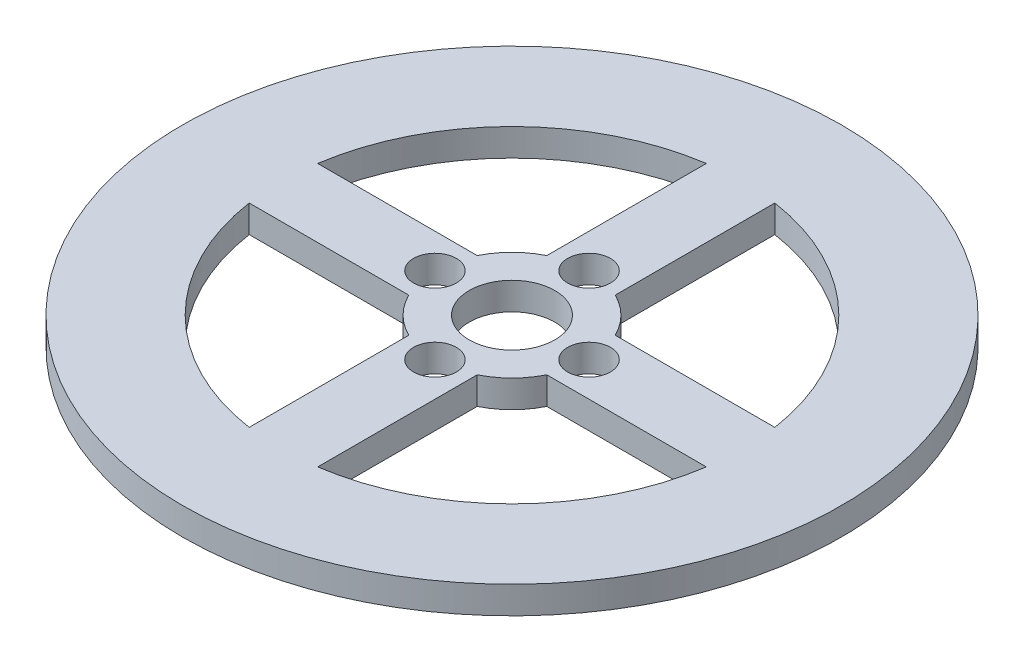
ISO-10303-21;
HEADER;
FILE_DESCRIPTION(('STEP AP214'),'2;1');
FILE_NAME('part.step','',(''),(''),'','','');
FILE_SCHEMA(('AUTOMOTIVE_DESIGN { 1 0 10303 214 1 1 1 1 }'));
ENDSEC;
DATA;
#1=APPLICATION_CONTEXT('core data for automotive mechanical design processes');
#2=APPLICATION_PROTOCOL_DEFINITION('international standard','automotive_design',2000,#1);
#3=PRODUCT_CONTEXT('',#1,'mechanical');
#4=PRODUCT('Part','Part','',(#3));
#5=PRODUCT_RELATED_PRODUCT_CATEGORY('part','',(#4));
#6=PRODUCT_DEFINITION_FORMATION('','',#4);
#7=PRODUCT_DEFINITION_CONTEXT('part definition',#1,'design');
#8=PRODUCT_DEFINITION('design','',#6,#7);
#9=PRODUCT_DEFINITION_SHAPE('','',#8);
#10=(LENGTH_UNIT() NAMED_UNIT(*) SI_UNIT(.MILLI.,.METRE.));
#11=(NAMED_UNIT(*) PLANE_ANGLE_UNIT() SI_UNIT($,.RADIAN.));
#12=(NAMED_UNIT(*) SI_UNIT($,.STERADIAN.) SOLID_ANGLE_UNIT());
#13=UNCERTAINTY_MEASURE_WITH_UNIT(LENGTH_MEASURE(1.E-05),#10,'distance_accuracy_value','');
#14=(GEOMETRIC_REPRESENTATION_CONTEXT(3) GLOBAL_UNCERTAINTY_ASSIGNED_CONTEXT((#13)) GLOBAL_UNIT_ASSIGNED_CONTEXT((#10,
#11,#12)) REPRESENTATION_CONTEXT('',''));
#15=CARTESIAN_POINT('',(0.,0.,0.));
#16=DIRECTION('',(0.,0.,1.));
#17=DIRECTION('',(1.,0.,0.));
#18=AXIS2_PLACEMENT_3D('',#15,#16,#17);
#19=CARTESIAN_POINT('',(0.,1.6,0.));
#20=DIRECTION('',(0.,1.,0.));
#21=DIRECTION('',(0.,0.,1.));
#22=AXIS2_PLACEMENT_3D('',#19,#20,#21);
#23=PLANE('',#22);
#24=CARTESIAN_POINT('',(0.,1.6,-4.5));
#25=DIRECTION('',(0.,1.,0.));
#26=DIRECTION('',(0.,0.,1.));
#27=AXIS2_PLACEMENT_3D('',#24,#25,#26);
#28=CIRCLE('',#27,1.25);
#29=CARTESIAN_POINT('',(0.,1.6,-3.25));
#30=VERTEX_POINT('',#29);
#31=EDGE_CURVE('E291',#30,#30,#28,.T.);
#32=ORIENTED_EDGE('',*,*,#31,.F.);
#33=EDGE_LOOP('',(#32));
#34=FACE_BOUND('',#33,.T.);
#35=CARTESIAN_POINT('',(2.54142111694787E-13,1.6,4.5));
#36=DIRECTION('',(0.,1.,0.));
#37=DIRECTION('',(0.,0.,1.));
#38=AXIS2_PLACEMENT_3D('',#35,#36,#37);
#39=CIRCLE('',#38,1.25000000000027);
#40=CARTESIAN_POINT('',(2.54142111694787E-13,1.6,5.75000000000027));
#41=VERTEX_POINT('',#40);
#42=EDGE_CURVE('E302',#41,#41,#39,.T.);
#43=ORIENTED_EDGE('',*,*,#42,.F.);
#44=EDGE_LOOP('',(#43));
#45=FACE_BOUND('',#44,.T.);
#46=CARTESIAN_POINT('',(4.50000000000013,1.6,-1.27071055847394E-13));
#47=DIRECTION('',(0.,1.,0.));
#48=DIRECTION('',(0.,0.,1.));
#49=AXIS2_PLACEMENT_3D('',#46,#47,#48);
#50=CIRCLE('',#49,1.2500000000001);
#51=CARTESIAN_POINT('',(4.50000000000013,1.6,1.24999999999997));
#52=VERTEX_POINT('',#51);
#53=EDGE_CURVE('E295',#52,#52,#50,.T.);
#54=ORIENTED_EDGE('',*,*,#53,.F.);
#55=EDGE_LOOP('',(#54));
#56=FACE_BOUND('',#55,.T.);
#57=CARTESIAN_POINT('',(0.,1.6,0.));
#58=DIRECTION('',(0.,1.,0.));
#59=DIRECTION('',(0.,0.,1.));
#60=AXIS2_PLACEMENT_3D('',#57,#58,#59);
#61=CIRCLE('',#60,2.5);
#62=CARTESIAN_POINT('',(0.,1.6,2.5));
#63=VERTEX_POINT('',#62);
#64=EDGE_CURVE('E312',#63,#63,#61,.T.);
#65=ORIENTED_EDGE('',*,*,#64,.F.);
#66=EDGE_LOOP('',(#65));
#67=FACE_BOUND('',#66,.T.);
#68=CARTESIAN_POINT('',(-4.49999999999987,1.6,1.2762214690701E-13));
#69=DIRECTION('',(0.,1.,0.));
#70=DIRECTION('',(0.,0.,1.));
#71=AXIS2_PLACEMENT_3D('',#68,#69,#70);
#72=CIRCLE('',#71,1.2500000000002);
#73=CARTESIAN_POINT('',(-4.49999999999987,1.6,1.25000000000033));
#74=VERTEX_POINT('',#73);
#75=EDGE_CURVE('E294',#74,#74,#72,.T.);
#76=ORIENTED_EDGE('',*,*,#75,.F.);
#77=EDGE_LOOP('',(#76));
#78=FACE_BOUND('',#77,.T.);
#79=CARTESIAN_POINT('',(0.,1.6,0.));
#80=DIRECTION('',(0.,1.,0.));
#81=DIRECTION('',(0.,0.,1.));
#82=AXIS2_PLACEMENT_3D('',#79,#80,#81);
#83=CIRCLE('',#82,19.25);
#84=CARTESIAN_POINT('',(0.,1.6,19.25));
#85=VERTEX_POINT('',#84);
#86=EDGE_CURVE('E12',#85,#85,#83,.T.);
#87=ORIENTED_EDGE('',*,*,#86,.T.);
#88=EDGE_LOOP('',(#87));
#89=FACE_BOUND('',#88,.T.);
#90=DIRECTION('',(0.,0.,1.));
#91=VECTOR('',#90,1.);
#92=CARTESIAN_POINT('',(-2.,1.6,0.));
#93=LINE('',#92,#91);
#94=CARTESIAN_POINT('',(-2.,1.6,-13.3510299228187));
#95=VERTEX_POINT('',#94);
#96=CARTESIAN_POINT('',(-2.,1.6,-4.03112887414927));
#97=VERTEX_POINT('',#96);
#98=EDGE_CURVE('E270',#95,#97,#93,.T.);
#99=ORIENTED_EDGE('',*,*,#98,.T.);
#100=CARTESIAN_POINT('',(0.,1.6,0.));
#101=DIRECTION('',(0.,1.,0.));
#102=DIRECTION('',(0.,0.,1.));
#103=AXIS2_PLACEMENT_3D('',#100,#101,#102);
#104=CIRCLE('',#103,4.5);
#105=CARTESIAN_POINT('',(-4.03112887414927,1.6,-2.));
#106=VERTEX_POINT('',#105);
#107=EDGE_CURVE('E198',#97,#106,#104,.T.);
#108=ORIENTED_EDGE('',*,*,#107,.T.);
#109=DIRECTION('',(-1.,0.,0.));
#110=VECTOR('',#109,1.);
#111=CARTESIAN_POINT('',(0.,1.6,-2.));
#112=LINE('',#111,#110);
#113=CARTESIAN_POINT('',(-13.3510299228187,1.6,-2.));
#114=VERTEX_POINT('',#113);
#115=EDGE_CURVE('E260',#106,#114,#112,.T.);
#116=ORIENTED_EDGE('',*,*,#115,.T.);
#117=CARTESIAN_POINT('',(0.,1.6,0.));
#118=DIRECTION('',(0.,1.,0.));
#119=DIRECTION('',(0.,0.,1.));
#120=AXIS2_PLACEMENT_3D('',#117,#118,#119);
#121=CIRCLE('',#120,13.5);
#122=EDGE_CURVE('E273',#95,#114,#121,.T.);
#123=ORIENTED_EDGE('',*,*,#122,.F.);
#124=EDGE_LOOP('',(#99,#108,#116,#123));
#125=FACE_BOUND('',#124,.T.);
#126=DIRECTION('',(1.,0.,0.));
#127=VECTOR('',#126,1.);
#128=CARTESIAN_POINT('',(0.,1.6,-2.));
#129=LINE('',#128,#127);
#130=CARTESIAN_POINT('',(4.03112887414927,1.6,-2.));
#131=VERTEX_POINT('',#130);
#132=CARTESIAN_POINT('',(13.3510299228187,1.6,-2.));
#133=VERTEX_POINT('',#132);
#134=EDGE_CURVE('E191',#131,#133,#129,.T.);
#135=ORIENTED_EDGE('',*,*,#134,.F.);
#136=CARTESIAN_POINT('',(0.,1.6,0.));
#137=DIRECTION('',(0.,1.,0.));
#138=DIRECTION('',(0.,0.,1.));
#139=AXIS2_PLACEMENT_3D('',#136,#137,#138);
#140=CIRCLE('',#139,4.5);
#141=CARTESIAN_POINT('',(2.,1.6,-4.03112887414927));
#142=VERTEX_POINT('',#141);
#143=EDGE_CURVE('E163',#131,#142,#140,.T.);
#144=ORIENTED_EDGE('',*,*,#143,.T.);
#145=DIRECTION('',(0.,0.,1.));
#146=VECTOR('',#145,1.);
#147=CARTESIAN_POINT('',(2.,1.6,0.));
#148=LINE('',#147,#146);
#149=CARTESIAN_POINT('',(2.,1.6,-13.3510299228187));
#150=VERTEX_POINT('',#149);
#151=EDGE_CURVE('E182',#150,#142,#148,.T.);
#152=ORIENTED_EDGE('',*,*,#151,.F.);
#153=CARTESIAN_POINT('',(0.,1.6,0.));
#154=DIRECTION('',(0.,1.,0.));
#155=DIRECTION('',(0.,0.,1.));
#156=AXIS2_PLACEMENT_3D('',#153,#154,#155);
#157=CIRCLE('',#156,13.5);
#158=EDGE_CURVE('E185',#133,#150,#157,.T.);
#159=ORIENTED_EDGE('',*,*,#158,.F.);
#160=EDGE_LOOP('',(#135,#144,#152,#159));
#161=FACE_BOUND('',#160,.T.);
#162=DIRECTION('',(0.,0.,-1.));
#163=VECTOR('',#162,1.);
#164=CARTESIAN_POINT('',(2.,1.6,0.));
#165=LINE('',#164,#163);
#166=CARTESIAN_POINT('',(2.,1.6,13.3510299228187));
#167=VERTEX_POINT('',#166);
#168=CARTESIAN_POINT('',(2.,1.6,4.03112887414927));
#169=VERTEX_POINT('',#168);
#170=EDGE_CURVE('E214',#167,#169,#165,.T.);
#171=ORIENTED_EDGE('',*,*,#170,.T.);
#172=CARTESIAN_POINT('',(0.,1.6,0.));
#173=DIRECTION('',(0.,1.,0.));
#174=DIRECTION('',(0.,0.,1.));
#175=AXIS2_PLACEMENT_3D('',#172,#173,#174);
#176=CIRCLE('',#175,4.5);
#177=CARTESIAN_POINT('',(4.03112887414927,1.6,2.));
#178=VERTEX_POINT('',#177);
#179=EDGE_CURVE('E65',#169,#178,#176,.T.);
#180=ORIENTED_EDGE('',*,*,#179,.T.);
#181=DIRECTION('',(1.,0.,0.));
#182=VECTOR('',#181,1.);
#183=CARTESIAN_POINT('',(0.,1.6,2.));
#184=LINE('',#183,#182);
#185=CARTESIAN_POINT('',(13.3510299228187,1.6,2.));
#186=VERTEX_POINT('',#185);
#187=EDGE_CURVE('E205',#178,#186,#184,.T.);
#188=ORIENTED_EDGE('',*,*,#187,.T.);
#189=CARTESIAN_POINT('',(0.,1.6,0.));
#190=DIRECTION('',(0.,1.,0.));
#191=DIRECTION('',(0.,0.,1.));
#192=AXIS2_PLACEMENT_3D('',#189,#190,#191);
#193=CIRCLE('',#192,13.5);
#194=EDGE_CURVE('E218',#167,#186,#193,.T.);
#195=ORIENTED_EDGE('',*,*,#194,.F.);
#196=EDGE_LOOP('',(#171,#180,#188,#195));
#197=FACE_BOUND('',#196,.T.);
#198=DIRECTION('',(-1.,0.,0.));
#199=VECTOR('',#198,1.);
#200=CARTESIAN_POINT('',(0.,1.6,2.));
#201=LINE('',#200,#199);
#202=CARTESIAN_POINT('',(-4.03112887414927,1.6,2.));
#203=VERTEX_POINT('',#202);
#204=CARTESIAN_POINT('',(-13.3510299228187,1.6,2.));
#205=VERTEX_POINT('',#204);
#206=EDGE_CURVE('E243',#203,#205,#201,.T.);
#207=ORIENTED_EDGE('',*,*,#206,.F.);
#208=CARTESIAN_POINT('',(0.,1.6,0.));
#209=DIRECTION('',(0.,1.,0.));
#210=DIRECTION('',(0.,0.,1.));
#211=AXIS2_PLACEMENT_3D('',#208,#209,#210);
#212=CIRCLE('',#211,4.5);
#213=CARTESIAN_POINT('',(-2.,1.6,4.03112887414927));
#214=VERTEX_POINT('',#213);
#215=EDGE_CURVE('E57',#203,#214,#212,.T.);
#216=ORIENTED_EDGE('',*,*,#215,.T.);
#217=DIRECTION('',(0.,0.,-1.));
#218=VECTOR('',#217,1.);
#219=CARTESIAN_POINT('',(-2.,1.6,0.));
#220=LINE('',#219,#218);
#221=CARTESIAN_POINT('',(-2.,1.6,13.3510299228187));
#222=VERTEX_POINT('',#221);
#223=EDGE_CURVE('E232',#222,#214,#220,.T.);
#224=ORIENTED_EDGE('',*,*,#223,.F.);
#225=CARTESIAN_POINT('',(0.,1.6,0.));
#226=DIRECTION('',(0.,1.,0.));
#227=DIRECTION('',(0.,0.,1.));
#228=AXIS2_PLACEMENT_3D('',#225,#226,#227);
#229=CIRCLE('',#228,13.5);
#230=EDGE_CURVE('E246',#205,#222,#229,.T.);
#231=ORIENTED_EDGE('',*,*,#230,.F.);
#232=EDGE_LOOP('',(#207,#216,#224,#231));
#233=FACE_BOUND('',#232,.T.);
#234=ADVANCED_FACE('F42',(#34,#45,#56,#67,#78,#89,#125,#161,#197,#233),#23,.T.);
#235=CARTESIAN_POINT('',(0.,0.,0.));
#236=DIRECTION('',(0.,1.,0.));
#237=DIRECTION('',(0.,0.,1.));
#238=AXIS2_PLACEMENT_3D('',#235,#236,#237);
#239=PLANE('',#238);
#240=CARTESIAN_POINT('',(0.,0.,0.));
#241=DIRECTION('',(0.,1.,0.));
#242=DIRECTION('',(0.,0.,1.));
#243=AXIS2_PLACEMENT_3D('',#240,#241,#242);
#244=CIRCLE('',#243,4.5);
#245=CARTESIAN_POINT('',(2.,0.,4.03112887414927));
#246=VERTEX_POINT('',#245);
#247=CARTESIAN_POINT('',(4.03112887414927,0.,2.));
#248=VERTEX_POINT('',#247);
#249=EDGE_CURVE('E202',#246,#248,#244,.T.);
#250=ORIENTED_EDGE('',*,*,#249,.F.);
#251=DIRECTION('',(0.,0.,-1.));
#252=VECTOR('',#251,1.);
#253=CARTESIAN_POINT('',(2.,0.,0.));
#254=LINE('',#253,#252);
#255=CARTESIAN_POINT('',(2.,0.,13.3510299228187));
#256=VERTEX_POINT('',#255);
#257=EDGE_CURVE('E204',#256,#246,#254,.T.);
#258=ORIENTED_EDGE('',*,*,#257,.F.);
#259=CARTESIAN_POINT('',(0.,0.,0.));
#260=DIRECTION('',(0.,1.,0.));
#261=DIRECTION('',(0.,0.,1.));
#262=AXIS2_PLACEMENT_3D('',#259,#260,#261);
#263=CIRCLE('',#262,13.5);
#264=CARTESIAN_POINT('',(13.3510299228187,0.,2.));
#265=VERTEX_POINT('',#264);
#266=EDGE_CURVE('E207',#256,#265,#263,.T.);
#267=ORIENTED_EDGE('',*,*,#266,.T.);
#268=DIRECTION('',(1.,0.,0.));
#269=VECTOR('',#268,1.);
#270=CARTESIAN_POINT('',(0.,0.,2.));
#271=LINE('',#270,#269);
#272=EDGE_CURVE('E210',#248,#265,#271,.T.);
#273=ORIENTED_EDGE('',*,*,#272,.F.);
#274=EDGE_LOOP('',(#250,#258,#267,#273));
#275=FACE_BOUND('',#274,.T.);
#276=CARTESIAN_POINT('',(0.,0.,0.));
#277=DIRECTION('',(0.,1.,0.));
#278=DIRECTION('',(0.,0.,1.));
#279=AXIS2_PLACEMENT_3D('',#276,#277,#278);
#280=CIRCLE('',#279,4.5);
#281=CARTESIAN_POINT('',(-2.,0.,-4.03112887414927));
#282=VERTEX_POINT('',#281);
#283=CARTESIAN_POINT('',(-4.03112887414927,0.,-2.));
#284=VERTEX_POINT('',#283);
#285=EDGE_CURVE('E257',#282,#284,#280,.T.);
#286=ORIENTED_EDGE('',*,*,#285,.F.);
#287=DIRECTION('',(0.,0.,1.));
#288=VECTOR('',#287,1.);
#289=CARTESIAN_POINT('',(-2.,0.,0.));
#290=LINE('',#289,#288);
#291=CARTESIAN_POINT('',(-2.,0.,-13.3510299228187));
#292=VERTEX_POINT('',#291);
#293=EDGE_CURVE('E259',#292,#282,#290,.T.);
#294=ORIENTED_EDGE('',*,*,#293,.F.);
#295=CARTESIAN_POINT('',(0.,0.,0.));
#296=DIRECTION('',(0.,1.,0.));
#297=DIRECTION('',(0.,0.,1.));
#298=AXIS2_PLACEMENT_3D('',#295,#296,#297);
#299=CIRCLE('',#298,13.5);
#300=CARTESIAN_POINT('',(-13.3510299228187,0.,-2.));
#301=VERTEX_POINT('',#300);
#302=EDGE_CURVE('E262',#292,#301,#299,.T.);
#303=ORIENTED_EDGE('',*,*,#302,.T.);
#304=DIRECTION('',(-1.,0.,0.));
#305=VECTOR('',#304,1.);
#306=CARTESIAN_POINT('',(0.,0.,-2.));
#307=LINE('',#306,#305);
#308=EDGE_CURVE('E265',#284,#301,#307,.T.);
#309=ORIENTED_EDGE('',*,*,#308,.F.);
#310=EDGE_LOOP('',(#286,#294,#303,#309));
#311=FACE_BOUND('',#310,.T.);
#312=CARTESIAN_POINT('',(0.,0.,-4.5));
#313=DIRECTION('',(0.,1.,0.));
#314=DIRECTION('',(0.,0.,1.));
#315=AXIS2_PLACEMENT_3D('',#312,#313,#314);
#316=CIRCLE('',#315,1.25);
#317=CARTESIAN_POINT('',(0.,0.,-3.25));
#318=VERTEX_POINT('',#317);
#319=EDGE_CURVE('E288',#318,#318,#316,.T.);
#320=ORIENTED_EDGE('',*,*,#319,.T.);
#321=EDGE_LOOP('',(#320));
#322=FACE_BOUND('',#321,.T.);
#323=CARTESIAN_POINT('',(2.54142111694787E-13,0.,4.5));
#324=DIRECTION('',(0.,1.,0.));
#325=DIRECTION('',(0.,0.,1.));
#326=AXIS2_PLACEMENT_3D('',#323,#324,#325);
#327=CIRCLE('',#326,1.25000000000027);
#328=CARTESIAN_POINT('',(2.54142111694787E-13,0.,5.75000000000027));
#329=VERTEX_POINT('',#328);
#330=EDGE_CURVE('E281',#329,#329,#327,.T.);
#331=ORIENTED_EDGE('',*,*,#330,.T.);
#332=EDGE_LOOP('',(#331));
#333=FACE_BOUND('',#332,.T.);
#334=CARTESIAN_POINT('',(4.50000000000013,0.,-1.27071055847394E-13));
#335=DIRECTION('',(0.,1.,0.));
#336=DIRECTION('',(0.,0.,1.));
#337=AXIS2_PLACEMENT_3D('',#334,#335,#336);
#338=CIRCLE('',#337,1.2500000000001);
#339=CARTESIAN_POINT('',(4.50000000000013,0.,1.24999999999997));
#340=VERTEX_POINT('',#339);
#341=EDGE_CURVE('E299',#340,#340,#338,.T.);
#342=ORIENTED_EDGE('',*,*,#341,.T.);
#343=EDGE_LOOP('',(#342));
#344=FACE_BOUND('',#343,.T.);
#345=CARTESIAN_POINT('',(0.,0.,0.));
#346=DIRECTION('',(0.,1.,0.));
#347=DIRECTION('',(0.,0.,1.));
#348=AXIS2_PLACEMENT_3D('',#345,#346,#347);
#349=CIRCLE('',#348,2.5);
#350=CARTESIAN_POINT('',(0.,0.,2.5));
#351=VERTEX_POINT('',#350);
#352=EDGE_CURVE('E298',#351,#351,#349,.T.);
#353=ORIENTED_EDGE('',*,*,#352,.T.);
#354=EDGE_LOOP('',(#353));
#355=FACE_BOUND('',#354,.T.);
#356=CARTESIAN_POINT('',(-4.49999999999987,0.,1.2762214690701E-13));
#357=DIRECTION('',(0.,1.,0.));
#358=DIRECTION('',(0.,0.,1.));
#359=AXIS2_PLACEMENT_3D('',#356,#357,#358);
#360=CIRCLE('',#359,1.2500000000002);
#361=CARTESIAN_POINT('',(-4.49999999999987,0.,1.25000000000033));
#362=VERTEX_POINT('',#361);
#363=EDGE_CURVE('E309',#362,#362,#360,.T.);
#364=ORIENTED_EDGE('',*,*,#363,.T.);
#365=EDGE_LOOP('',(#364));
#366=FACE_BOUND('',#365,.T.);
#367=CARTESIAN_POINT('',(0.,0.,0.));
#368=DIRECTION('',(0.,1.,0.));
#369=DIRECTION('',(0.,0.,1.));
#370=AXIS2_PLACEMENT_3D('',#367,#368,#369);
#371=CIRCLE('',#370,19.25);
#372=CARTESIAN_POINT('',(0.,0.,19.25));
#373=VERTEX_POINT('',#372);
#374=EDGE_CURVE('E46',#373,#373,#371,.T.);
#375=ORIENTED_EDGE('',*,*,#374,.F.);
#376=EDGE_LOOP('',(#375));
#377=FACE_BOUND('',#376,.T.);
#378=CARTESIAN_POINT('',(0.,0.,0.));
#379=DIRECTION('',(0.,1.,0.));
#380=DIRECTION('',(0.,0.,1.));
#381=AXIS2_PLACEMENT_3D('',#378,#379,#380);
#382=CIRCLE('',#381,4.5);
#383=CARTESIAN_POINT('',(4.03112887414927,0.,-2.));
#384=VERTEX_POINT('',#383);
#385=CARTESIAN_POINT('',(2.,0.,-4.03112887414927));
#386=VERTEX_POINT('',#385);
#387=EDGE_CURVE('E160',#384,#386,#382,.T.);
#388=ORIENTED_EDGE('',*,*,#387,.F.);
#389=DIRECTION('',(1.,0.,0.));
#390=VECTOR('',#389,1.);
#391=CARTESIAN_POINT('',(0.,0.,-2.));
#392=LINE('',#391,#390);
#393=CARTESIAN_POINT('',(13.3510299228187,0.,-2.));
#394=VERTEX_POINT('',#393);
#395=EDGE_CURVE('E172',#384,#394,#392,.T.);
#396=ORIENTED_EDGE('',*,*,#395,.T.);
#397=CARTESIAN_POINT('',(0.,0.,0.));
#398=DIRECTION('',(0.,1.,0.));
#399=DIRECTION('',(0.,0.,1.));
#400=AXIS2_PLACEMENT_3D('',#397,#398,#399);
#401=CIRCLE('',#400,13.5);
#402=CARTESIAN_POINT('',(2.,0.,-13.3510299228187));
#403=VERTEX_POINT('',#402);
#404=EDGE_CURVE('E176',#394,#403,#401,.T.);
#405=ORIENTED_EDGE('',*,*,#404,.T.);
#406=DIRECTION('',(0.,0.,1.));
#407=VECTOR('',#406,1.);
#408=CARTESIAN_POINT('',(2.,0.,0.));
#409=LINE('',#408,#407);
#410=EDGE_CURVE('E168',#403,#386,#409,.T.);
#411=ORIENTED_EDGE('',*,*,#410,.T.);
#412=EDGE_LOOP('',(#388,#396,#405,#411));
#413=FACE_BOUND('',#412,.T.);
#414=CARTESIAN_POINT('',(0.,0.,0.));
#415=DIRECTION('',(0.,1.,0.));
#416=DIRECTION('',(0.,0.,1.));
#417=AXIS2_PLACEMENT_3D('',#414,#415,#416);
#418=CIRCLE('',#417,4.5);
#419=CARTESIAN_POINT('',(-4.03112887414927,0.,2.));
#420=VERTEX_POINT('',#419);
#421=CARTESIAN_POINT('',(-2.,0.,4.03112887414927));
#422=VERTEX_POINT('',#421);
#423=EDGE_CURVE('E229',#420,#422,#418,.T.);
#424=ORIENTED_EDGE('',*,*,#423,.F.);
#425=DIRECTION('',(-1.,0.,0.));
#426=VECTOR('',#425,1.);
#427=CARTESIAN_POINT('',(0.,0.,2.));
#428=LINE('',#427,#426);
#429=CARTESIAN_POINT('',(-13.3510299228187,0.,2.));
#430=VERTEX_POINT('',#429);
#431=EDGE_CURVE('E231',#420,#430,#428,.T.);
#432=ORIENTED_EDGE('',*,*,#431,.T.);
#433=CARTESIAN_POINT('',(0.,0.,0.));
#434=DIRECTION('',(0.,1.,0.));
#435=DIRECTION('',(0.,0.,1.));
#436=AXIS2_PLACEMENT_3D('',#433,#434,#435);
#437=CIRCLE('',#436,13.5);
#438=CARTESIAN_POINT('',(-2.,0.,13.3510299228187));
#439=VERTEX_POINT('',#438);
#440=EDGE_CURVE('E235',#430,#439,#437,.T.);
#441=ORIENTED_EDGE('',*,*,#440,.T.);
#442=DIRECTION('',(0.,0.,-1.));
#443=VECTOR('',#442,1.);
#444=CARTESIAN_POINT('',(-2.,0.,0.));
#445=LINE('',#444,#443);
#446=EDGE_CURVE('E238',#439,#422,#445,.T.);
#447=ORIENTED_EDGE('',*,*,#446,.T.);
#448=EDGE_LOOP('',(#424,#432,#441,#447));
#449=FACE_BOUND('',#448,.T.);
#450=ADVANCED_FACE('F179',(#275,#311,#322,#333,#344,#355,#366,#377,#413,#449),#239,.F.);
#451=CARTESIAN_POINT('',(0.,1.6,0.));
#452=DIRECTION('',(0.,-1.,0.));
#453=DIRECTION('',(0.,0.,-1.));
#454=AXIS2_PLACEMENT_3D('',#451,#452,#453);
#455=CYLINDRICAL_SURFACE('',#454,19.25);
#456=ORIENTED_EDGE('',*,*,#86,.F.);
#457=EDGE_LOOP('',(#456));
#458=FACE_BOUND('',#457,.T.);
#459=ORIENTED_EDGE('',*,*,#374,.T.);
#460=EDGE_LOOP('',(#459));
#461=FACE_BOUND('',#460,.T.);
#462=ADVANCED_FACE('F44',(#458,#461),#455,.T.);
#463=CARTESIAN_POINT('',(-4.49999999999987,0.,1.2762214690701E-13));
#464=DIRECTION('',(0.,1.,0.));
#465=DIRECTION('',(0.,0.,1.));
#466=AXIS2_PLACEMENT_3D('',#463,#464,#465);
#467=CYLINDRICAL_SURFACE('',#466,1.2500000000002);
#468=ORIENTED_EDGE('',*,*,#363,.F.);
#469=EDGE_LOOP('',(#468));
#470=FACE_BOUND('',#469,.T.);
#471=ORIENTED_EDGE('',*,*,#75,.T.);
#472=EDGE_LOOP('',(#471));
#473=FACE_BOUND('',#472,.T.);
#474=ADVANCED_FACE('F324',(#470,#473),#467,.F.);
#475=CARTESIAN_POINT('',(0.,0.,0.));
#476=DIRECTION('',(0.,1.,0.));
#477=DIRECTION('',(0.,0.,1.));
#478=AXIS2_PLACEMENT_3D('',#475,#476,#477);
#479=CYLINDRICAL_SURFACE('',#478,2.5);
#480=ORIENTED_EDGE('',*,*,#352,.F.);
#481=EDGE_LOOP('',(#480));
#482=FACE_BOUND('',#481,.T.);
#483=ORIENTED_EDGE('',*,*,#64,.T.);
#484=EDGE_LOOP('',(#483));
#485=FACE_BOUND('',#484,.T.);
#486=ADVANCED_FACE('F320',(#482,#485),#479,.F.);
#487=CARTESIAN_POINT('',(4.50000000000013,0.,-1.27071055847394E-13));
#488=DIRECTION('',(0.,1.,0.));
#489=DIRECTION('',(0.,0.,1.));
#490=AXIS2_PLACEMENT_3D('',#487,#488,#489);
#491=CYLINDRICAL_SURFACE('',#490,1.2500000000001);
#492=ORIENTED_EDGE('',*,*,#341,.F.);
#493=EDGE_LOOP('',(#492));
#494=FACE_BOUND('',#493,.T.);
#495=ORIENTED_EDGE('',*,*,#53,.T.);
#496=EDGE_LOOP('',(#495));
#497=FACE_BOUND('',#496,.T.);
#498=ADVANCED_FACE('F323',(#494,#497),#491,.F.);
#499=CARTESIAN_POINT('',(2.54142111694787E-13,0.,4.5));
#500=DIRECTION('',(0.,1.,0.));
#501=DIRECTION('',(0.,0.,1.));
#502=AXIS2_PLACEMENT_3D('',#499,#500,#501);
#503=CYLINDRICAL_SURFACE('',#502,1.25000000000027);
#504=ORIENTED_EDGE('',*,*,#42,.T.);
#505=EDGE_LOOP('',(#504));
#506=FACE_BOUND('',#505,.T.);
#507=ORIENTED_EDGE('',*,*,#330,.F.);
#508=EDGE_LOOP('',(#507));
#509=FACE_BOUND('',#508,.T.);
#510=ADVANCED_FACE('F391',(#506,#509),#503,.F.);
#511=CARTESIAN_POINT('',(0.,0.,-4.5));
#512=DIRECTION('',(0.,1.,0.));
#513=DIRECTION('',(0.,0.,1.));
#514=AXIS2_PLACEMENT_3D('',#511,#512,#513);
#515=CYLINDRICAL_SURFACE('',#514,1.25);
#516=ORIENTED_EDGE('',*,*,#319,.F.);
#517=EDGE_LOOP('',(#516));
#518=FACE_BOUND('',#517,.T.);
#519=ORIENTED_EDGE('',*,*,#31,.T.);
#520=EDGE_LOOP('',(#519));
#521=FACE_BOUND('',#520,.T.);
#522=ADVANCED_FACE('F387',(#518,#521),#515,.F.);
#523=CARTESIAN_POINT('',(0.,0.,0.));
#524=DIRECTION('',(0.,1.,0.));
#525=DIRECTION('',(0.,0.,1.));
#526=AXIS2_PLACEMENT_3D('',#523,#524,#525);
#527=CYLINDRICAL_SURFACE('',#526,4.5);
#528=ORIENTED_EDGE('',*,*,#107,.F.);
#529=DIRECTION('',(0.,1.,0.));
#530=VECTOR('',#529,1.);
#531=CARTESIAN_POINT('',(-2.,0.,-4.03112887414927));
#532=LINE('',#531,#530);
#533=EDGE_CURVE('E267',#282,#97,#532,.T.);
#534=ORIENTED_EDGE('',*,*,#533,.F.);
#535=ORIENTED_EDGE('',*,*,#285,.T.);
#536=DIRECTION('',(0.,1.,0.));
#537=VECTOR('',#536,1.);
#538=CARTESIAN_POINT('',(-4.03112887414927,0.,-2.));
#539=LINE('',#538,#537);
#540=EDGE_CURVE('E278',#284,#106,#539,.T.);
#541=ORIENTED_EDGE('',*,*,#540,.T.);
#542=EDGE_LOOP('',(#528,#534,#535,#541));
#543=FACE_BOUND('',#542,.T.);
#544=ADVANCED_FACE('F376',(#543),#527,.T.);
#545=CARTESIAN_POINT('',(0.,0.,-2.));
#546=DIRECTION('',(0.,0.,-1.));
#547=DIRECTION('',(-1.,0.,0.));
#548=AXIS2_PLACEMENT_3D('',#545,#546,#547);
#549=PLANE('',#548);
#550=ORIENTED_EDGE('',*,*,#115,.F.);
#551=ORIENTED_EDGE('',*,*,#540,.F.);
#552=ORIENTED_EDGE('',*,*,#308,.T.);
#553=DIRECTION('',(0.,1.,0.));
#554=VECTOR('',#553,1.);
#555=CARTESIAN_POINT('',(-13.3510299228187,0.,-2.));
#556=LINE('',#555,#554);
#557=EDGE_CURVE('E282',#301,#114,#556,.T.);
#558=ORIENTED_EDGE('',*,*,#557,.T.);
#559=EDGE_LOOP('',(#550,#551,#552,#558));
#560=FACE_BOUND('',#559,.T.);
#561=ADVANCED_FACE('F372',(#560),#549,.T.);
#562=CARTESIAN_POINT('',(0.,0.,0.));
#563=DIRECTION('',(0.,1.,0.));
#564=DIRECTION('',(0.,0.,1.));
#565=AXIS2_PLACEMENT_3D('',#562,#563,#564);
#566=CYLINDRICAL_SURFACE('',#565,13.5);
#567=ORIENTED_EDGE('',*,*,#122,.T.);
#568=ORIENTED_EDGE('',*,*,#557,.F.);
#569=ORIENTED_EDGE('',*,*,#302,.F.);
#570=DIRECTION('',(0.,1.,0.));
#571=VECTOR('',#570,1.);
#572=CARTESIAN_POINT('',(-2.,0.,-13.3510299228187));
#573=LINE('',#572,#571);
#574=EDGE_CURVE('E284',#292,#95,#573,.T.);
#575=ORIENTED_EDGE('',*,*,#574,.T.);
#576=EDGE_LOOP('',(#567,#568,#569,#575));
#577=FACE_BOUND('',#576,.T.);
#578=ADVANCED_FACE('F375',(#577),#566,.F.);
#579=CARTESIAN_POINT('',(-2.,0.,0.));
#580=DIRECTION('',(-1.,0.,0.));
#581=DIRECTION('',(0.,0.,1.));
#582=AXIS2_PLACEMENT_3D('',#579,#580,#581);
#583=PLANE('',#582);
#584=ORIENTED_EDGE('',*,*,#98,.F.);
#585=ORIENTED_EDGE('',*,*,#574,.F.);
#586=ORIENTED_EDGE('',*,*,#293,.T.);
#587=ORIENTED_EDGE('',*,*,#533,.T.);
#588=EDGE_LOOP('',(#584,#585,#586,#587));
#589=FACE_BOUND('',#588,.T.);
#590=ADVANCED_FACE('F380',(#589),#583,.T.);
#591=CARTESIAN_POINT('',(0.,0.,0.));
#592=DIRECTION('',(0.,1.,0.));
#593=DIRECTION('',(0.,0.,1.));
#594=AXIS2_PLACEMENT_3D('',#591,#592,#593);
#595=CYLINDRICAL_SURFACE('',#594,4.5);
#596=ORIENTED_EDGE('',*,*,#143,.F.);
#597=DIRECTION('',(0.,1.,0.));
#598=VECTOR('',#597,1.);
#599=CARTESIAN_POINT('',(4.03112887414927,0.,-2.));
#600=LINE('',#599,#598);
#601=EDGE_CURVE('E156',#384,#131,#600,.T.);
#602=ORIENTED_EDGE('',*,*,#601,.F.);
#603=ORIENTED_EDGE('',*,*,#387,.T.);
#604=DIRECTION('',(0.,1.,0.));
#605=VECTOR('',#604,1.);
#606=CARTESIAN_POINT('',(2.,0.,-4.03112887414927));
#607=LINE('',#606,#605);
#608=EDGE_CURVE('E196',#386,#142,#607,.T.);
#609=ORIENTED_EDGE('',*,*,#608,.T.);
#610=EDGE_LOOP('',(#596,#602,#603,#609));
#611=FACE_BOUND('',#610,.T.);
#612=ADVANCED_FACE('F158',(#611),#595,.T.);
#613=CARTESIAN_POINT('',(2.,0.,0.));
#614=DIRECTION('',(-1.,0.,0.));
#615=DIRECTION('',(0.,0.,1.));
#616=AXIS2_PLACEMENT_3D('',#613,#614,#615);
#617=PLANE('',#616);
#618=ORIENTED_EDGE('',*,*,#151,.T.);
#619=ORIENTED_EDGE('',*,*,#608,.F.);
#620=ORIENTED_EDGE('',*,*,#410,.F.);
#621=DIRECTION('',(0.,1.,0.));
#622=VECTOR('',#621,1.);
#623=CARTESIAN_POINT('',(2.,0.,-13.3510299228187));
#624=LINE('',#623,#622);
#625=EDGE_CURVE('E199',#403,#150,#624,.T.);
#626=ORIENTED_EDGE('',*,*,#625,.T.);
#627=EDGE_LOOP('',(#618,#619,#620,#626));
#628=FACE_BOUND('',#627,.T.);
#629=ADVANCED_FACE('F458',(#628),#617,.F.);
#630=CARTESIAN_POINT('',(0.,0.,0.));
#631=DIRECTION('',(0.,1.,0.));
#632=DIRECTION('',(0.,0.,1.));
#633=AXIS2_PLACEMENT_3D('',#630,#631,#632);
#634=CYLINDRICAL_SURFACE('',#633,13.5);
#635=ORIENTED_EDGE('',*,*,#158,.T.);
#636=ORIENTED_EDGE('',*,*,#625,.F.);
#637=ORIENTED_EDGE('',*,*,#404,.F.);
#638=DIRECTION('',(0.,1.,0.));
#639=VECTOR('',#638,1.);
#640=CARTESIAN_POINT('',(13.3510299228187,0.,-2.));
#641=LINE('',#640,#639);
#642=EDGE_CURVE('E167',#394,#133,#641,.T.);
#643=ORIENTED_EDGE('',*,*,#642,.T.);
#644=EDGE_LOOP('',(#635,#636,#637,#643));
#645=FACE_BOUND('',#644,.T.);
#646=ADVANCED_FACE('F453',(#645),#634,.F.);
#647=CARTESIAN_POINT('',(0.,0.,-2.));
#648=DIRECTION('',(0.,0.,1.));
#649=DIRECTION('',(1.,0.,0.));
#650=AXIS2_PLACEMENT_3D('',#647,#648,#649);
#651=PLANE('',#650);
#652=ORIENTED_EDGE('',*,*,#134,.T.);
#653=ORIENTED_EDGE('',*,*,#642,.F.);
#654=ORIENTED_EDGE('',*,*,#395,.F.);
#655=ORIENTED_EDGE('',*,*,#601,.T.);
#656=EDGE_LOOP('',(#652,#653,#654,#655));
#657=FACE_BOUND('',#656,.T.);
#658=ADVANCED_FACE('F173',(#657),#651,.F.);
#659=CARTESIAN_POINT('',(0.,0.,0.));
#660=DIRECTION('',(0.,1.,0.));
#661=DIRECTION('',(0.,0.,1.));
#662=AXIS2_PLACEMENT_3D('',#659,#660,#661);
#663=CYLINDRICAL_SURFACE('',#662,4.5);
#664=ORIENTED_EDGE('',*,*,#179,.F.);
#665=DIRECTION('',(0.,1.,0.));
#666=VECTOR('',#665,1.);
#667=CARTESIAN_POINT('',(2.,0.,4.03112887414927));
#668=LINE('',#667,#666);
#669=EDGE_CURVE('E212',#246,#169,#668,.T.);
#670=ORIENTED_EDGE('',*,*,#669,.F.);
#671=ORIENTED_EDGE('',*,*,#249,.T.);
#672=DIRECTION('',(0.,1.,0.));
#673=VECTOR('',#672,1.);
#674=CARTESIAN_POINT('',(4.03112887414927,0.,2.));
#675=LINE('',#674,#673);
#676=EDGE_CURVE('E192',#248,#178,#675,.T.);
#677=ORIENTED_EDGE('',*,*,#676,.T.);
#678=EDGE_LOOP('',(#664,#670,#671,#677));
#679=FACE_BOUND('',#678,.T.);
#680=ADVANCED_FACE('F433',(#679),#663,.T.);
#681=CARTESIAN_POINT('',(0.,0.,2.));
#682=DIRECTION('',(0.,0.,1.));
#683=DIRECTION('',(1.,0.,0.));
#684=AXIS2_PLACEMENT_3D('',#681,#682,#683);
#685=PLANE('',#684);
#686=ORIENTED_EDGE('',*,*,#187,.F.);
#687=ORIENTED_EDGE('',*,*,#676,.F.);
#688=ORIENTED_EDGE('',*,*,#272,.T.);
#689=DIRECTION('',(0.,1.,0.));
#690=VECTOR('',#689,1.);
#691=CARTESIAN_POINT('',(13.3510299228187,0.,2.));
#692=LINE('',#691,#690);
#693=EDGE_CURVE('E224',#265,#186,#692,.T.);
#694=ORIENTED_EDGE('',*,*,#693,.T.);
#695=EDGE_LOOP('',(#686,#687,#688,#694));
#696=FACE_BOUND('',#695,.T.);
#697=ADVANCED_FACE('F435',(#696),#685,.T.);
#698=CARTESIAN_POINT('',(0.,0.,0.));
#699=DIRECTION('',(0.,1.,0.));
#700=DIRECTION('',(0.,0.,1.));
#701=AXIS2_PLACEMENT_3D('',#698,#699,#700);
#702=CYLINDRICAL_SURFACE('',#701,13.5);
#703=ORIENTED_EDGE('',*,*,#194,.T.);
#704=ORIENTED_EDGE('',*,*,#693,.F.);
#705=ORIENTED_EDGE('',*,*,#266,.F.);
#706=DIRECTION('',(0.,1.,0.));
#707=VECTOR('',#706,1.);
#708=CARTESIAN_POINT('',(2.,0.,13.3510299228187));
#709=LINE('',#708,#707);
#710=EDGE_CURVE('E226',#256,#167,#709,.T.);
#711=ORIENTED_EDGE('',*,*,#710,.T.);
#712=EDGE_LOOP('',(#703,#704,#705,#711));
#713=FACE_BOUND('',#712,.T.);
#714=ADVANCED_FACE('F438',(#713),#702,.F.);
#715=CARTESIAN_POINT('',(2.,0.,0.));
#716=DIRECTION('',(1.,0.,0.));
#717=DIRECTION('',(0.,0.,-1.));
#718=AXIS2_PLACEMENT_3D('',#715,#716,#717);
#719=PLANE('',#718);
#720=ORIENTED_EDGE('',*,*,#170,.F.);
#721=ORIENTED_EDGE('',*,*,#710,.F.);
#722=ORIENTED_EDGE('',*,*,#257,.T.);
#723=ORIENTED_EDGE('',*,*,#669,.T.);
#724=EDGE_LOOP('',(#720,#721,#722,#723));
#725=FACE_BOUND('',#724,.T.);
#726=ADVANCED_FACE('F371',(#725),#719,.T.);
#727=CARTESIAN_POINT('',(0.,0.,0.));
#728=DIRECTION('',(0.,1.,0.));
#729=DIRECTION('',(0.,0.,1.));
#730=AXIS2_PLACEMENT_3D('',#727,#728,#729);
#731=CYLINDRICAL_SURFACE('',#730,4.5);
#732=ORIENTED_EDGE('',*,*,#215,.F.);
#733=DIRECTION('',(0.,1.,0.));
#734=VECTOR('',#733,1.);
#735=CARTESIAN_POINT('',(-4.03112887414927,0.,2.));
#736=LINE('',#735,#734);
#737=EDGE_CURVE('E241',#420,#203,#736,.T.);
#738=ORIENTED_EDGE('',*,*,#737,.F.);
#739=ORIENTED_EDGE('',*,*,#423,.T.);
#740=DIRECTION('',(0.,1.,0.));
#741=VECTOR('',#740,1.);
#742=CARTESIAN_POINT('',(-2.,0.,4.03112887414927));
#743=LINE('',#742,#741);
#744=EDGE_CURVE('E215',#422,#214,#743,.T.);
#745=ORIENTED_EDGE('',*,*,#744,.T.);
#746=EDGE_LOOP('',(#732,#738,#739,#745));
#747=FACE_BOUND('',#746,.T.);
#748=ADVANCED_FACE('F352',(#747),#731,.T.);
#749=CARTESIAN_POINT('',(-2.,0.,0.));
#750=DIRECTION('',(1.,0.,0.));
#751=DIRECTION('',(0.,0.,-1.));
#752=AXIS2_PLACEMENT_3D('',#749,#750,#751);
#753=PLANE('',#752);
#754=ORIENTED_EDGE('',*,*,#223,.T.);
#755=ORIENTED_EDGE('',*,*,#744,.F.);
#756=ORIENTED_EDGE('',*,*,#446,.F.);
#757=DIRECTION('',(0.,1.,0.));
#758=VECTOR('',#757,1.);
#759=CARTESIAN_POINT('',(-2.,0.,13.3510299228187));
#760=LINE('',#759,#758);
#761=EDGE_CURVE('E252',#439,#222,#760,.T.);
#762=ORIENTED_EDGE('',*,*,#761,.T.);
#763=EDGE_LOOP('',(#754,#755,#756,#762));
#764=FACE_BOUND('',#763,.T.);
#765=ADVANCED_FACE('F356',(#764),#753,.F.);
#766=CARTESIAN_POINT('',(0.,0.,0.));
#767=DIRECTION('',(0.,1.,0.));
#768=DIRECTION('',(0.,0.,1.));
#769=AXIS2_PLACEMENT_3D('',#766,#767,#768);
#770=CYLINDRICAL_SURFACE('',#769,13.5);
#771=ORIENTED_EDGE('',*,*,#230,.T.);
#772=ORIENTED_EDGE('',*,*,#761,.F.);
#773=ORIENTED_EDGE('',*,*,#440,.F.);
#774=DIRECTION('',(0.,1.,0.));
#775=VECTOR('',#774,1.);
#776=CARTESIAN_POINT('',(-13.3510299228187,0.,2.));
#777=LINE('',#776,#775);
#778=EDGE_CURVE('E254',#430,#205,#777,.T.);
#779=ORIENTED_EDGE('',*,*,#778,.T.);
#780=EDGE_LOOP('',(#771,#772,#773,#779));
#781=FACE_BOUND('',#780,.T.);
#782=ADVANCED_FACE('F358',(#781),#770,.F.);
#783=CARTESIAN_POINT('',(0.,0.,2.));
#784=DIRECTION('',(0.,0.,-1.));
#785=DIRECTION('',(-1.,0.,0.));
#786=AXIS2_PLACEMENT_3D('',#783,#784,#785);
#787=PLANE('',#786);
#788=ORIENTED_EDGE('',*,*,#206,.T.);
#789=ORIENTED_EDGE('',*,*,#778,.F.);
#790=ORIENTED_EDGE('',*,*,#431,.F.);
#791=ORIENTED_EDGE('',*,*,#737,.T.);
#792=EDGE_LOOP('',(#788,#789,#790,#791));
#793=FACE_BOUND('',#792,.T.);
#794=ADVANCED_FACE('F349',(#793),#787,.F.);
#795=CLOSED_SHELL('',(#234,#450,#462,#474,#486,#498,#510,#522,#544,#561,#578,#590,#612,#629,
#646,#658,#680,#697,#714,#726,#748,#765,#782,#794));
#796=MANIFOLD_SOLID_BREP('B2',#795);
#797=ADVANCED_BREP_SHAPE_REPRESENTATION('',(#18,#796),#14);
#798=SHAPE_DEFINITION_REPRESENTATION(#9,#797);
ENDSEC;
END-ISO-10303-21;
